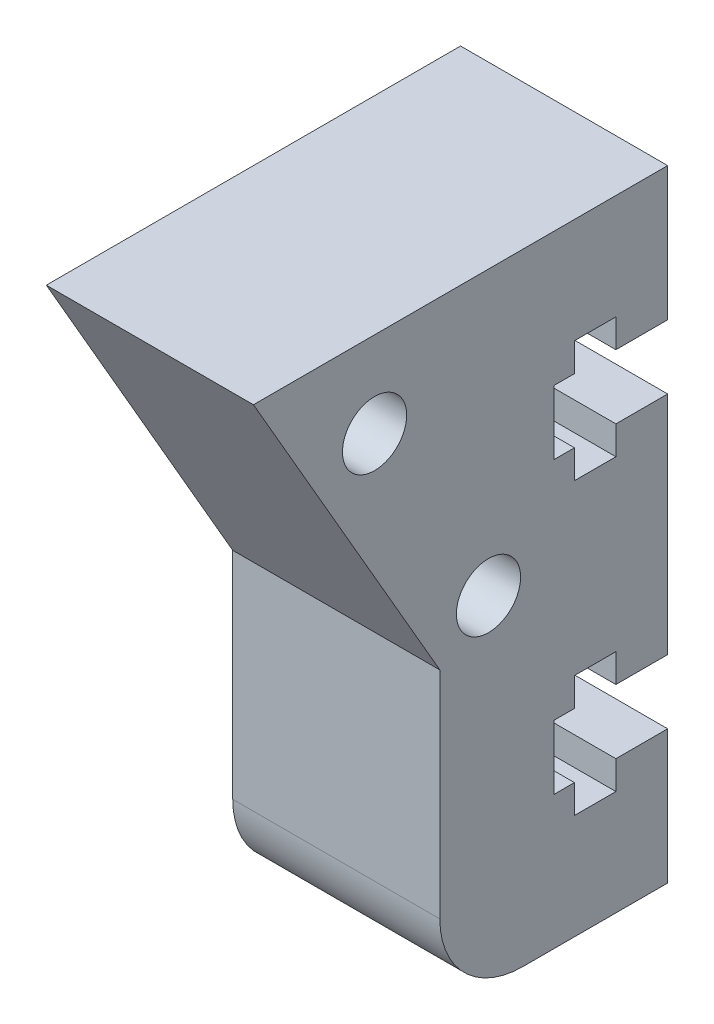
ISO-10303-21;
HEADER;
FILE_DESCRIPTION(('STEP AP214'),'2;1');
FILE_NAME('part.step','',(''),(''),'','','');
FILE_SCHEMA(('AUTOMOTIVE_DESIGN { 1 0 10303 214 1 1 1 1 }'));
ENDSEC;
DATA;
#1=APPLICATION_CONTEXT('core data for automotive mechanical design processes');
#2=APPLICATION_PROTOCOL_DEFINITION('international standard','automotive_design',2000,#1);
#3=PRODUCT_CONTEXT('',#1,'mechanical');
#4=PRODUCT('Part','Part','',(#3));
#5=PRODUCT_RELATED_PRODUCT_CATEGORY('part','',(#4));
#6=PRODUCT_DEFINITION_FORMATION('','',#4);
#7=PRODUCT_DEFINITION_CONTEXT('part definition',#1,'design');
#8=PRODUCT_DEFINITION('design','',#6,#7);
#9=PRODUCT_DEFINITION_SHAPE('','',#8);
#10=(LENGTH_UNIT() NAMED_UNIT(*) SI_UNIT(.MILLI.,.METRE.));
#11=(NAMED_UNIT(*) PLANE_ANGLE_UNIT() SI_UNIT($,.RADIAN.));
#12=(NAMED_UNIT(*) SI_UNIT($,.STERADIAN.) SOLID_ANGLE_UNIT());
#13=UNCERTAINTY_MEASURE_WITH_UNIT(LENGTH_MEASURE(1.E-05),#10,'distance_accuracy_value','');
#14=(GEOMETRIC_REPRESENTATION_CONTEXT(3) GLOBAL_UNCERTAINTY_ASSIGNED_CONTEXT((#13)) GLOBAL_UNIT_ASSIGNED_CONTEXT((#10,
#11,#12)) REPRESENTATION_CONTEXT('',''));
#15=CARTESIAN_POINT('',(0.,0.,0.));
#16=DIRECTION('',(0.,0.,1.));
#17=DIRECTION('',(1.,0.,0.));
#18=AXIS2_PLACEMENT_3D('',#15,#16,#17);
#19=CARTESIAN_POINT('',(170.434880274018,63.9423133029425,11.));
#20=DIRECTION('',(0.,0.,-1.));
#21=DIRECTION('',(0.,1.,0.));
#22=AXIS2_PLACEMENT_3D('',#19,#20,#21);
#23=PLANE('',#22);
#24=DIRECTION('',(1.,0.,0.));
#25=VECTOR('',#24,1.);
#26=CARTESIAN_POINT('',(170.434880274018,53.5307705710611,11.));
#27=LINE('',#26,#25);
#28=CARTESIAN_POINT('',(170.434880274018,53.5307705710611,11.));
#29=VERTEX_POINT('',#28);
#30=CARTESIAN_POINT('',(180.434880274018,53.5307705710611,11.));
#31=VERTEX_POINT('',#30);
#32=EDGE_CURVE('E229',#29,#31,#27,.T.);
#33=ORIENTED_EDGE('',*,*,#32,.T.);
#34=DIRECTION('',(0.,1.,0.));
#35=VECTOR('',#34,1.);
#36=CARTESIAN_POINT('',(180.434880274018,63.9423133029425,11.));
#37=LINE('',#36,#35);
#38=CARTESIAN_POINT('',(180.434880274018,63.9423133029425,11.));
#39=VERTEX_POINT('',#38);
#40=EDGE_CURVE('E255',#31,#39,#37,.T.);
#41=ORIENTED_EDGE('',*,*,#40,.T.);
#42=DIRECTION('',(1.,0.,0.));
#43=VECTOR('',#42,1.);
#44=CARTESIAN_POINT('',(170.434880274018,63.9423133029425,11.));
#45=LINE('',#44,#43);
#46=CARTESIAN_POINT('',(170.434880274018,63.9423133029425,11.));
#47=VERTEX_POINT('',#46);
#48=EDGE_CURVE('E249',#47,#39,#45,.T.);
#49=ORIENTED_EDGE('',*,*,#48,.F.);
#50=DIRECTION('',(0.,1.,0.));
#51=VECTOR('',#50,1.);
#52=CARTESIAN_POINT('',(170.434880274018,63.9423133029425,11.));
#53=LINE('',#52,#51);
#54=EDGE_CURVE('E243',#29,#47,#53,.T.);
#55=ORIENTED_EDGE('',*,*,#54,.F.);
#56=EDGE_LOOP('',(#33,#41,#49,#55));
#57=FACE_BOUND('',#56,.T.);
#58=ADVANCED_FACE('F34',(#57),#23,.F.);
#59=CARTESIAN_POINT('',(0.,0.,0.));
#60=DIRECTION('',(0.,0.,-1.));
#61=DIRECTION('',(-1.,0.,0.));
#62=AXIS2_PLACEMENT_3D('',#59,#60,#61);
#63=PLANE('',#62);
#64=DIRECTION('',(1.,0.,0.));
#65=VECTOR('',#64,1.);
#66=CARTESIAN_POINT('',(170.434880274018,59.0807705710764,0.));
#67=LINE('',#66,#65);
#68=CARTESIAN_POINT('',(170.434880274018,59.0807705710764,0.));
#69=VERTEX_POINT('',#68);
#70=CARTESIAN_POINT('',(180.434880274018,59.0807705710764,0.));
#71=VERTEX_POINT('',#70);
#72=EDGE_CURVE('E332',#69,#71,#67,.T.);
#73=ORIENTED_EDGE('',*,*,#72,.F.);
#74=DIRECTION('',(0.,-1.,0.));
#75=VECTOR('',#74,1.);
#76=CARTESIAN_POINT('',(170.434880274018,79.5307705710627,0.));
#77=LINE('',#76,#75);
#78=CARTESIAN_POINT('',(170.434880274018,69.9807705710764,0.));
#79=VERTEX_POINT('',#78);
#80=EDGE_CURVE('E459',#79,#69,#77,.T.);
#81=ORIENTED_EDGE('',*,*,#80,.F.);
#82=DIRECTION('',(1.,0.,0.));
#83=VECTOR('',#82,1.);
#84=CARTESIAN_POINT('',(170.434880274018,69.9807705710764,0.));
#85=LINE('',#84,#83);
#86=CARTESIAN_POINT('',(180.434880274018,69.9807705710764,0.));
#87=VERTEX_POINT('',#86);
#88=EDGE_CURVE('E425',#79,#87,#85,.T.);
#89=ORIENTED_EDGE('',*,*,#88,.T.);
#90=DIRECTION('',(0.,1.,0.));
#91=VECTOR('',#90,1.);
#92=CARTESIAN_POINT('',(180.434880274018,79.5307705710627,0.));
#93=LINE('',#92,#91);
#94=EDGE_CURVE('E451',#71,#87,#93,.T.);
#95=ORIENTED_EDGE('',*,*,#94,.F.);
#96=EDGE_LOOP('',(#73,#81,#89,#95));
#97=FACE_BOUND('',#96,.T.);
#98=ADVANCED_FACE('F533',(#97),#63,.T.);
#99=DIRECTION('',(1.,0.,0.));
#100=VECTOR('',#99,1.);
#101=CARTESIAN_POINT('',(170.434880274018,73.0807705710764,0.));
#102=LINE('',#101,#100);
#103=CARTESIAN_POINT('',(170.434880274018,73.0807705710764,0.));
#104=VERTEX_POINT('',#103);
#105=CARTESIAN_POINT('',(180.434880274018,73.0807705710764,0.));
#106=VERTEX_POINT('',#105);
#107=EDGE_CURVE('E422',#104,#106,#102,.T.);
#108=ORIENTED_EDGE('',*,*,#107,.F.);
#109=CARTESIAN_POINT('',(170.434880274018,79.5307705710627,0.));
#110=VERTEX_POINT('',#109);
#111=EDGE_CURVE('E455',#110,#104,#77,.T.);
#112=ORIENTED_EDGE('',*,*,#111,.F.);
#113=DIRECTION('',(-1.,0.,0.));
#114=VECTOR('',#113,1.);
#115=CARTESIAN_POINT('',(180.434880274018,79.5307705710627,0.));
#116=LINE('',#115,#114);
#117=CARTESIAN_POINT('',(180.434880274018,79.5307705710627,0.));
#118=VERTEX_POINT('',#117);
#119=EDGE_CURVE('E450',#118,#110,#116,.T.);
#120=ORIENTED_EDGE('',*,*,#119,.F.);
#121=EDGE_CURVE('E424',#106,#118,#93,.T.);
#122=ORIENTED_EDGE('',*,*,#121,.F.);
#123=EDGE_LOOP('',(#108,#112,#120,#122));
#124=FACE_BOUND('',#123,.T.);
#125=ADVANCED_FACE('F545',(#124),#63,.T.);
#126=CARTESIAN_POINT('',(180.434880274018,79.5307705710627,30.));
#127=DIRECTION('',(-1.,0.,0.));
#128=DIRECTION('',(0.,0.,1.));
#129=AXIS2_PLACEMENT_3D('',#126,#127,#128);
#130=PLANE('',#129);
#131=CARTESIAN_POINT('',(180.434880274018,75.401605446463,14.1519237886476));
#132=DIRECTION('',(1.,0.,0.));
#133=DIRECTION('',(0.,0.,-1.));
#134=AXIS2_PLACEMENT_3D('',#131,#132,#133);
#135=CIRCLE('',#134,1.54999999999999);
#136=CARTESIAN_POINT('',(180.434880274018,75.401605446463,12.6019237886476));
#137=VERTEX_POINT('',#136);
#138=EDGE_CURVE('E472',#137,#137,#135,.T.);
#139=ORIENTED_EDGE('',*,*,#138,.F.);
#140=EDGE_LOOP('',(#139));
#141=FACE_BOUND('',#140,.T.);
#142=CARTESIAN_POINT('',(180.434880274018,65.8753260048354,8.65192378864772));
#143=DIRECTION('',(1.,0.,0.));
#144=DIRECTION('',(0.,0.,-1.));
#145=AXIS2_PLACEMENT_3D('',#142,#143,#144);
#146=CIRCLE('',#145,1.55000000000021);
#147=CARTESIAN_POINT('',(180.434880274018,65.8753260048354,7.1019237886475));
#148=VERTEX_POINT('',#147);
#149=EDGE_CURVE('E258',#148,#148,#146,.T.);
#150=ORIENTED_EDGE('',*,*,#149,.F.);
#151=EDGE_LOOP('',(#150));
#152=FACE_BOUND('',#151,.T.);
#153=ORIENTED_EDGE('',*,*,#40,.F.);
#154=CARTESIAN_POINT('',(180.434880274018,53.530770571061,7.));
#155=DIRECTION('',(-1.,0.,0.));
#156=DIRECTION('',(0.,0.,-1.));
#157=AXIS2_PLACEMENT_3D('',#154,#155,#156);
#158=CIRCLE('',#157,4.);
#159=CARTESIAN_POINT('',(180.434880274018,49.530770571061,6.99999999999997));
#160=VERTEX_POINT('',#159);
#161=EDGE_CURVE('E51',#160,#31,#158,.T.);
#162=ORIENTED_EDGE('',*,*,#161,.F.);
#163=DIRECTION('',(0.,0.,-1.));
#164=VECTOR('',#163,1.);
#165=CARTESIAN_POINT('',(180.434880274018,49.530770571061,30.));
#166=LINE('',#165,#164);
#167=CARTESIAN_POINT('',(180.434880274018,49.530770571061,0.));
#168=VERTEX_POINT('',#167);
#169=EDGE_CURVE('E462',#160,#168,#166,.T.);
#170=ORIENTED_EDGE('',*,*,#169,.T.);
#171=CARTESIAN_POINT('',(180.434880274018,55.9807705710764,0.));
#172=VERTEX_POINT('',#171);
#173=EDGE_CURVE('E447',#168,#172,#93,.T.);
#174=ORIENTED_EDGE('',*,*,#173,.T.);
#175=DIRECTION('',(0.,0.,-1.));
#176=VECTOR('',#175,1.);
#177=CARTESIAN_POINT('',(180.434880274018,55.9807705710764,0.));
#178=LINE('',#177,#176);
#179=CARTESIAN_POINT('',(180.434880274018,55.9807705710764,2.5));
#180=VERTEX_POINT('',#179);
#181=EDGE_CURVE('E59',#180,#172,#178,.T.);
#182=ORIENTED_EDGE('',*,*,#181,.F.);
#183=DIRECTION('',(0.,1.,0.));
#184=VECTOR('',#183,1.);
#185=CARTESIAN_POINT('',(180.434880274018,55.9807705710764,2.5));
#186=LINE('',#185,#184);
#187=CARTESIAN_POINT('',(180.434880274018,54.6057705710764,2.5));
#188=VERTEX_POINT('',#187);
#189=EDGE_CURVE('E328',#188,#180,#186,.T.);
#190=ORIENTED_EDGE('',*,*,#189,.F.);
#191=DIRECTION('',(0.,0.,-1.));
#192=VECTOR('',#191,1.);
#193=CARTESIAN_POINT('',(180.434880274018,54.6057705710764,4.5));
#194=LINE('',#193,#192);
#195=CARTESIAN_POINT('',(180.434880274018,54.6057705710764,4.5));
#196=VERTEX_POINT('',#195);
#197=EDGE_CURVE('E325',#196,#188,#194,.T.);
#198=ORIENTED_EDGE('',*,*,#197,.F.);
#199=DIRECTION('',(0.,-1.,0.));
#200=VECTOR('',#199,1.);
#201=CARTESIAN_POINT('',(180.434880274018,55.9807705710764,4.5));
#202=LINE('',#201,#200);
#203=CARTESIAN_POINT('',(180.434880274018,55.9807705710764,4.5));
#204=VERTEX_POINT('',#203);
#205=EDGE_CURVE('E322',#204,#196,#202,.T.);
#206=ORIENTED_EDGE('',*,*,#205,.F.);
#207=DIRECTION('',(0.,0.,-1.));
#208=VECTOR('',#207,1.);
#209=CARTESIAN_POINT('',(180.434880274018,55.9807705710764,4.5));
#210=LINE('',#209,#208);
#211=CARTESIAN_POINT('',(180.434880274018,55.9807705710764,5.5));
#212=VERTEX_POINT('',#211);
#213=EDGE_CURVE('E319',#212,#204,#210,.T.);
#214=ORIENTED_EDGE('',*,*,#213,.F.);
#215=DIRECTION('',(0.,-1.,0.));
#216=VECTOR('',#215,1.);
#217=CARTESIAN_POINT('',(180.434880274018,59.0807705710764,5.5));
#218=LINE('',#217,#216);
#219=CARTESIAN_POINT('',(180.434880274018,59.0807705710764,5.5));
#220=VERTEX_POINT('',#219);
#221=EDGE_CURVE('E316',#220,#212,#218,.T.);
#222=ORIENTED_EDGE('',*,*,#221,.F.);
#223=DIRECTION('',(0.,0.,1.));
#224=VECTOR('',#223,1.);
#225=CARTESIAN_POINT('',(180.434880274018,59.0807705710764,4.5));
#226=LINE('',#225,#224);
#227=CARTESIAN_POINT('',(180.434880274018,59.0807705710764,4.5));
#228=VERTEX_POINT('',#227);
#229=EDGE_CURVE('E313',#228,#220,#226,.T.);
#230=ORIENTED_EDGE('',*,*,#229,.F.);
#231=DIRECTION('',(0.,-1.,0.));
#232=VECTOR('',#231,1.);
#233=CARTESIAN_POINT('',(180.434880274018,60.4557705710764,4.5));
#234=LINE('',#233,#232);
#235=CARTESIAN_POINT('',(180.434880274018,60.4557705710764,4.5));
#236=VERTEX_POINT('',#235);
#237=EDGE_CURVE('E310',#236,#228,#234,.T.);
#238=ORIENTED_EDGE('',*,*,#237,.F.);
#239=DIRECTION('',(0.,0.,1.));
#240=VECTOR('',#239,1.);
#241=CARTESIAN_POINT('',(180.434880274018,60.4557705710764,4.5));
#242=LINE('',#241,#240);
#243=CARTESIAN_POINT('',(180.434880274018,60.4557705710764,2.5));
#244=VERTEX_POINT('',#243);
#245=EDGE_CURVE('E307',#244,#236,#242,.T.);
#246=ORIENTED_EDGE('',*,*,#245,.F.);
#247=DIRECTION('',(0.,1.,0.));
#248=VECTOR('',#247,1.);
#249=CARTESIAN_POINT('',(180.434880274018,60.4557705710764,2.5));
#250=LINE('',#249,#248);
#251=CARTESIAN_POINT('',(180.434880274018,59.0807705710764,2.5));
#252=VERTEX_POINT('',#251);
#253=EDGE_CURVE('E304',#252,#244,#250,.T.);
#254=ORIENTED_EDGE('',*,*,#253,.F.);
#255=DIRECTION('',(0.,0.,1.));
#256=VECTOR('',#255,1.);
#257=CARTESIAN_POINT('',(180.434880274018,59.0807705710764,0.));
#258=LINE('',#257,#256);
#259=EDGE_CURVE('E266',#71,#252,#258,.T.);
#260=ORIENTED_EDGE('',*,*,#259,.F.);
#261=ORIENTED_EDGE('',*,*,#94,.T.);
#262=DIRECTION('',(0.,0.,-1.));
#263=VECTOR('',#262,1.);
#264=CARTESIAN_POINT('',(180.434880274018,69.9807705710764,0.));
#265=LINE('',#264,#263);
#266=CARTESIAN_POINT('',(180.434880274018,69.9807705710764,2.5));
#267=VERTEX_POINT('',#266);
#268=EDGE_CURVE('E360',#267,#87,#265,.T.);
#269=ORIENTED_EDGE('',*,*,#268,.F.);
#270=DIRECTION('',(0.,1.,0.));
#271=VECTOR('',#270,1.);
#272=CARTESIAN_POINT('',(180.434880274018,69.9807705710764,2.5));
#273=LINE('',#272,#271);
#274=CARTESIAN_POINT('',(180.434880274018,68.6057705710764,2.5));
#275=VERTEX_POINT('',#274);
#276=EDGE_CURVE('E417',#275,#267,#273,.T.);
#277=ORIENTED_EDGE('',*,*,#276,.F.);
#278=DIRECTION('',(0.,0.,-1.));
#279=VECTOR('',#278,1.);
#280=CARTESIAN_POINT('',(180.434880274018,68.6057705710764,4.5));
#281=LINE('',#280,#279);
#282=CARTESIAN_POINT('',(180.434880274018,68.6057705710764,4.5));
#283=VERTEX_POINT('',#282);
#284=EDGE_CURVE('E414',#283,#275,#281,.T.);
#285=ORIENTED_EDGE('',*,*,#284,.F.);
#286=DIRECTION('',(0.,-1.,0.));
#287=VECTOR('',#286,1.);
#288=CARTESIAN_POINT('',(180.434880274018,69.9807705710764,4.5));
#289=LINE('',#288,#287);
#290=CARTESIAN_POINT('',(180.434880274018,69.9807705710764,4.5));
#291=VERTEX_POINT('',#290);
#292=EDGE_CURVE('E411',#291,#283,#289,.T.);
#293=ORIENTED_EDGE('',*,*,#292,.F.);
#294=DIRECTION('',(0.,0.,-1.));
#295=VECTOR('',#294,1.);
#296=CARTESIAN_POINT('',(180.434880274018,69.9807705710764,4.5));
#297=LINE('',#296,#295);
#298=CARTESIAN_POINT('',(180.434880274018,69.9807705710764,5.5));
#299=VERTEX_POINT('',#298);
#300=EDGE_CURVE('E408',#299,#291,#297,.T.);
#301=ORIENTED_EDGE('',*,*,#300,.F.);
#302=DIRECTION('',(0.,-1.,0.));
#303=VECTOR('',#302,1.);
#304=CARTESIAN_POINT('',(180.434880274018,73.0807705710764,5.5));
#305=LINE('',#304,#303);
#306=CARTESIAN_POINT('',(180.434880274018,73.0807705710764,5.5));
#307=VERTEX_POINT('',#306);
#308=EDGE_CURVE('E405',#307,#299,#305,.T.);
#309=ORIENTED_EDGE('',*,*,#308,.F.);
#310=DIRECTION('',(0.,0.,1.));
#311=VECTOR('',#310,1.);
#312=CARTESIAN_POINT('',(180.434880274018,73.0807705710764,4.5));
#313=LINE('',#312,#311);
#314=CARTESIAN_POINT('',(180.434880274018,73.0807705710764,4.5));
#315=VERTEX_POINT('',#314);
#316=EDGE_CURVE('E402',#315,#307,#313,.T.);
#317=ORIENTED_EDGE('',*,*,#316,.F.);
#318=DIRECTION('',(0.,-1.,0.));
#319=VECTOR('',#318,1.);
#320=CARTESIAN_POINT('',(180.434880274018,74.4557705710764,4.5));
#321=LINE('',#320,#319);
#322=CARTESIAN_POINT('',(180.434880274018,74.4557705710764,4.5));
#323=VERTEX_POINT('',#322);
#324=EDGE_CURVE('E399',#323,#315,#321,.T.);
#325=ORIENTED_EDGE('',*,*,#324,.F.);
#326=DIRECTION('',(0.,0.,1.));
#327=VECTOR('',#326,1.);
#328=CARTESIAN_POINT('',(180.434880274018,74.4557705710764,4.5));
#329=LINE('',#328,#327);
#330=CARTESIAN_POINT('',(180.434880274018,74.4557705710764,2.5));
#331=VERTEX_POINT('',#330);
#332=EDGE_CURVE('E396',#331,#323,#329,.T.);
#333=ORIENTED_EDGE('',*,*,#332,.F.);
#334=DIRECTION('',(0.,1.,0.));
#335=VECTOR('',#334,1.);
#336=CARTESIAN_POINT('',(180.434880274018,74.4557705710764,2.5));
#337=LINE('',#336,#335);
#338=CARTESIAN_POINT('',(180.434880274018,73.0807705710764,2.5));
#339=VERTEX_POINT('',#338);
#340=EDGE_CURVE('E393',#339,#331,#337,.T.);
#341=ORIENTED_EDGE('',*,*,#340,.F.);
#342=DIRECTION('',(0.,0.,1.));
#343=VECTOR('',#342,1.);
#344=CARTESIAN_POINT('',(180.434880274018,73.0807705710764,0.));
#345=LINE('',#344,#343);
#346=EDGE_CURVE('E334',#106,#339,#345,.T.);
#347=ORIENTED_EDGE('',*,*,#346,.F.);
#348=ORIENTED_EDGE('',*,*,#121,.T.);
#349=DIRECTION('',(0.,0.,-1.));
#350=VECTOR('',#349,1.);
#351=CARTESIAN_POINT('',(180.434880274018,79.5307705710627,30.));
#352=LINE('',#351,#350);
#353=CARTESIAN_POINT('',(180.434880274018,79.5307705710627,20.0000000000016));
#354=VERTEX_POINT('',#353);
#355=EDGE_CURVE('E11',#354,#118,#352,.T.);
#356=ORIENTED_EDGE('',*,*,#355,.F.);
#357=DIRECTION('',(0.,0.866025403784406,0.500000000000057));
#358=VECTOR('',#357,1.);
#359=CARTESIAN_POINT('',(180.434880274018,79.5307705710627,20.0000000000016));
#360=LINE('',#359,#358);
#361=EDGE_CURVE('E252',#39,#354,#360,.T.);
#362=ORIENTED_EDGE('',*,*,#361,.F.);
#363=EDGE_LOOP('',(#153,#162,#170,#174,#182,#190,#198,#206,#214,#222,#230,#238,#246,#254,#260,
#261,#269,#277,#285,#293,#301,#309,#317,#325,#333,#341,#347,#348,#356,#362));
#364=FACE_BOUND('',#363,.T.);
#365=ADVANCED_FACE('F36',(#141,#152,#364),#130,.F.);
#366=CARTESIAN_POINT('',(180.434880274018,79.5307705710627,30.));
#367=DIRECTION('',(0.,-1.,0.));
#368=DIRECTION('',(0.,0.,-1.));
#369=AXIS2_PLACEMENT_3D('',#366,#367,#368);
#370=PLANE('',#369);
#371=DIRECTION('',(0.,0.,-1.));
#372=VECTOR('',#371,1.);
#373=CARTESIAN_POINT('',(170.434880274018,79.5307705710627,30.));
#374=LINE('',#373,#372);
#375=CARTESIAN_POINT('',(170.434880274018,79.5307705710627,20.0000000000016));
#376=VERTEX_POINT('',#375);
#377=EDGE_CURVE('E43',#376,#110,#374,.T.);
#378=ORIENTED_EDGE('',*,*,#377,.F.);
#379=DIRECTION('',(1.,0.,0.));
#380=VECTOR('',#379,1.);
#381=CARTESIAN_POINT('',(170.434880274018,79.5307705710627,20.0000000000016));
#382=LINE('',#381,#380);
#383=EDGE_CURVE('E263',#376,#354,#382,.T.);
#384=ORIENTED_EDGE('',*,*,#383,.T.);
#385=ORIENTED_EDGE('',*,*,#355,.T.);
#386=ORIENTED_EDGE('',*,*,#119,.T.);
#387=EDGE_LOOP('',(#378,#384,#385,#386));
#388=FACE_BOUND('',#387,.T.);
#389=ADVANCED_FACE('F548',(#388),#370,.F.);
#390=CARTESIAN_POINT('',(170.434880274018,79.5307705710627,30.));
#391=DIRECTION('',(1.,0.,0.));
#392=DIRECTION('',(0.,0.,-1.));
#393=AXIS2_PLACEMENT_3D('',#390,#391,#392);
#394=PLANE('',#393);
#395=CARTESIAN_POINT('',(170.434880274018,75.401605446463,14.1519237886476));
#396=DIRECTION('',(1.,0.,0.));
#397=DIRECTION('',(0.,0.,-1.));
#398=AXIS2_PLACEMENT_3D('',#395,#396,#397);
#399=CIRCLE('',#398,1.54999999999999);
#400=CARTESIAN_POINT('',(170.434880274018,75.401605446463,12.6019237886476));
#401=VERTEX_POINT('',#400);
#402=EDGE_CURVE('E38',#401,#401,#399,.T.);
#403=ORIENTED_EDGE('',*,*,#402,.T.);
#404=EDGE_LOOP('',(#403));
#405=FACE_BOUND('',#404,.T.);
#406=CARTESIAN_POINT('',(170.434880274018,65.8753260048354,8.65192378864772));
#407=DIRECTION('',(1.,0.,0.));
#408=DIRECTION('',(0.,0.,-1.));
#409=AXIS2_PLACEMENT_3D('',#406,#407,#408);
#410=CIRCLE('',#409,1.55000000000021);
#411=CARTESIAN_POINT('',(170.434880274018,65.8753260048354,7.1019237886475));
#412=VERTEX_POINT('',#411);
#413=EDGE_CURVE('E261',#412,#412,#410,.T.);
#414=ORIENTED_EDGE('',*,*,#413,.T.);
#415=EDGE_LOOP('',(#414));
#416=FACE_BOUND('',#415,.T.);
#417=DIRECTION('',(0.,0.,-1.));
#418=VECTOR('',#417,1.);
#419=CARTESIAN_POINT('',(170.434880274018,49.530770571061,30.));
#420=LINE('',#419,#418);
#421=CARTESIAN_POINT('',(170.434880274018,49.530770571061,6.99999999999997));
#422=VERTEX_POINT('',#421);
#423=CARTESIAN_POINT('',(170.434880274018,49.530770571061,0.));
#424=VERTEX_POINT('',#423);
#425=EDGE_CURVE('E246',#422,#424,#420,.T.);
#426=ORIENTED_EDGE('',*,*,#425,.F.);
#427=CARTESIAN_POINT('',(170.434880274018,53.530770571061,7.));
#428=DIRECTION('',(-1.,0.,0.));
#429=DIRECTION('',(0.,0.,-1.));
#430=AXIS2_PLACEMENT_3D('',#427,#428,#429);
#431=CIRCLE('',#430,4.);
#432=EDGE_CURVE('E232',#422,#29,#431,.T.);
#433=ORIENTED_EDGE('',*,*,#432,.T.);
#434=ORIENTED_EDGE('',*,*,#54,.T.);
#435=DIRECTION('',(0.,0.866025403784406,0.500000000000057));
#436=VECTOR('',#435,1.);
#437=CARTESIAN_POINT('',(170.434880274018,79.5307705710627,20.0000000000016));
#438=LINE('',#437,#436);
#439=EDGE_CURVE('E251',#47,#376,#438,.T.);
#440=ORIENTED_EDGE('',*,*,#439,.T.);
#441=ORIENTED_EDGE('',*,*,#377,.T.);
#442=ORIENTED_EDGE('',*,*,#111,.T.);
#443=DIRECTION('',(0.,0.,1.));
#444=VECTOR('',#443,1.);
#445=CARTESIAN_POINT('',(170.434880274018,73.0807705710764,0.));
#446=LINE('',#445,#444);
#447=CARTESIAN_POINT('',(170.434880274018,73.0807705710764,2.5));
#448=VERTEX_POINT('',#447);
#449=EDGE_CURVE('E356',#104,#448,#446,.T.);
#450=ORIENTED_EDGE('',*,*,#449,.T.);
#451=DIRECTION('',(0.,1.,0.));
#452=VECTOR('',#451,1.);
#453=CARTESIAN_POINT('',(170.434880274018,74.4557705710764,2.5));
#454=LINE('',#453,#452);
#455=CARTESIAN_POINT('',(170.434880274018,74.4557705710764,2.5));
#456=VERTEX_POINT('',#455);
#457=EDGE_CURVE('E359',#448,#456,#454,.T.);
#458=ORIENTED_EDGE('',*,*,#457,.T.);
#459=DIRECTION('',(0.,0.,1.));
#460=VECTOR('',#459,1.);
#461=CARTESIAN_POINT('',(170.434880274018,74.4557705710764,4.5));
#462=LINE('',#461,#460);
#463=CARTESIAN_POINT('',(170.434880274018,74.4557705710764,4.5));
#464=VERTEX_POINT('',#463);
#465=EDGE_CURVE('E363',#456,#464,#462,.T.);
#466=ORIENTED_EDGE('',*,*,#465,.T.);
#467=DIRECTION('',(0.,-1.,0.));
#468=VECTOR('',#467,1.);
#469=CARTESIAN_POINT('',(170.434880274018,74.4557705710764,4.5));
#470=LINE('',#469,#468);
#471=CARTESIAN_POINT('',(170.434880274018,73.0807705710764,4.5));
#472=VERTEX_POINT('',#471);
#473=EDGE_CURVE('E366',#464,#472,#470,.T.);
#474=ORIENTED_EDGE('',*,*,#473,.T.);
#475=DIRECTION('',(0.,0.,1.));
#476=VECTOR('',#475,1.);
#477=CARTESIAN_POINT('',(170.434880274018,73.0807705710764,4.5));
#478=LINE('',#477,#476);
#479=CARTESIAN_POINT('',(170.434880274018,73.0807705710764,5.5));
#480=VERTEX_POINT('',#479);
#481=EDGE_CURVE('E369',#472,#480,#478,.T.);
#482=ORIENTED_EDGE('',*,*,#481,.T.);
#483=DIRECTION('',(0.,-1.,0.));
#484=VECTOR('',#483,1.);
#485=CARTESIAN_POINT('',(170.434880274018,73.0807705710764,5.5));
#486=LINE('',#485,#484);
#487=CARTESIAN_POINT('',(170.434880274018,69.9807705710764,5.5));
#488=VERTEX_POINT('',#487);
#489=EDGE_CURVE('E372',#480,#488,#486,.T.);
#490=ORIENTED_EDGE('',*,*,#489,.T.);
#491=DIRECTION('',(0.,0.,-1.));
#492=VECTOR('',#491,1.);
#493=CARTESIAN_POINT('',(170.434880274018,69.9807705710764,4.5));
#494=LINE('',#493,#492);
#495=CARTESIAN_POINT('',(170.434880274018,69.9807705710764,4.5));
#496=VERTEX_POINT('',#495);
#497=EDGE_CURVE('E375',#488,#496,#494,.T.);
#498=ORIENTED_EDGE('',*,*,#497,.T.);
#499=DIRECTION('',(0.,-1.,0.));
#500=VECTOR('',#499,1.);
#501=CARTESIAN_POINT('',(170.434880274018,69.9807705710764,4.5));
#502=LINE('',#501,#500);
#503=CARTESIAN_POINT('',(170.434880274018,68.6057705710764,4.5));
#504=VERTEX_POINT('',#503);
#505=EDGE_CURVE('E378',#496,#504,#502,.T.);
#506=ORIENTED_EDGE('',*,*,#505,.T.);
#507=DIRECTION('',(0.,0.,-1.));
#508=VECTOR('',#507,1.);
#509=CARTESIAN_POINT('',(170.434880274018,68.6057705710764,4.5));
#510=LINE('',#509,#508);
#511=CARTESIAN_POINT('',(170.434880274018,68.6057705710764,2.5));
#512=VERTEX_POINT('',#511);
#513=EDGE_CURVE('E381',#504,#512,#510,.T.);
#514=ORIENTED_EDGE('',*,*,#513,.T.);
#515=DIRECTION('',(0.,1.,0.));
#516=VECTOR('',#515,1.);
#517=CARTESIAN_POINT('',(170.434880274018,69.9807705710764,2.5));
#518=LINE('',#517,#516);
#519=CARTESIAN_POINT('',(170.434880274018,69.9807705710764,2.5));
#520=VERTEX_POINT('',#519);
#521=EDGE_CURVE('E384',#512,#520,#518,.T.);
#522=ORIENTED_EDGE('',*,*,#521,.T.);
#523=DIRECTION('',(0.,0.,-1.));
#524=VECTOR('',#523,1.);
#525=CARTESIAN_POINT('',(170.434880274018,69.9807705710764,0.));
#526=LINE('',#525,#524);
#527=EDGE_CURVE('E387',#520,#79,#526,.T.);
#528=ORIENTED_EDGE('',*,*,#527,.T.);
#529=ORIENTED_EDGE('',*,*,#80,.T.);
#530=DIRECTION('',(0.,0.,1.));
#531=VECTOR('',#530,1.);
#532=CARTESIAN_POINT('',(170.434880274018,59.0807705710764,0.));
#533=LINE('',#532,#531);
#534=CARTESIAN_POINT('',(170.434880274018,59.0807705710764,2.5));
#535=VERTEX_POINT('',#534);
#536=EDGE_CURVE('E268',#69,#535,#533,.T.);
#537=ORIENTED_EDGE('',*,*,#536,.T.);
#538=DIRECTION('',(0.,1.,0.));
#539=VECTOR('',#538,1.);
#540=CARTESIAN_POINT('',(170.434880274018,60.4557705710764,2.5));
#541=LINE('',#540,#539);
#542=CARTESIAN_POINT('',(170.434880274018,60.4557705710764,2.5));
#543=VERTEX_POINT('',#542);
#544=EDGE_CURVE('E271',#535,#543,#541,.T.);
#545=ORIENTED_EDGE('',*,*,#544,.T.);
#546=DIRECTION('',(0.,0.,1.));
#547=VECTOR('',#546,1.);
#548=CARTESIAN_POINT('',(170.434880274018,60.4557705710764,4.5));
#549=LINE('',#548,#547);
#550=CARTESIAN_POINT('',(170.434880274018,60.4557705710764,4.5));
#551=VERTEX_POINT('',#550);
#552=EDGE_CURVE('E274',#543,#551,#549,.T.);
#553=ORIENTED_EDGE('',*,*,#552,.T.);
#554=DIRECTION('',(0.,-1.,0.));
#555=VECTOR('',#554,1.);
#556=CARTESIAN_POINT('',(170.434880274018,60.4557705710764,4.5));
#557=LINE('',#556,#555);
#558=CARTESIAN_POINT('',(170.434880274018,59.0807705710764,4.5));
#559=VERTEX_POINT('',#558);
#560=EDGE_CURVE('E277',#551,#559,#557,.T.);
#561=ORIENTED_EDGE('',*,*,#560,.T.);
#562=DIRECTION('',(0.,0.,1.));
#563=VECTOR('',#562,1.);
#564=CARTESIAN_POINT('',(170.434880274018,59.0807705710764,4.5));
#565=LINE('',#564,#563);
#566=CARTESIAN_POINT('',(170.434880274018,59.0807705710764,5.5));
#567=VERTEX_POINT('',#566);
#568=EDGE_CURVE('E280',#559,#567,#565,.T.);
#569=ORIENTED_EDGE('',*,*,#568,.T.);
#570=DIRECTION('',(0.,-1.,0.));
#571=VECTOR('',#570,1.);
#572=CARTESIAN_POINT('',(170.434880274018,59.0807705710764,5.5));
#573=LINE('',#572,#571);
#574=CARTESIAN_POINT('',(170.434880274018,55.9807705710764,5.5));
#575=VERTEX_POINT('',#574);
#576=EDGE_CURVE('E283',#567,#575,#573,.T.);
#577=ORIENTED_EDGE('',*,*,#576,.T.);
#578=DIRECTION('',(0.,0.,-1.));
#579=VECTOR('',#578,1.);
#580=CARTESIAN_POINT('',(170.434880274018,55.9807705710764,4.5));
#581=LINE('',#580,#579);
#582=CARTESIAN_POINT('',(170.434880274018,55.9807705710764,4.5));
#583=VERTEX_POINT('',#582);
#584=EDGE_CURVE('E286',#575,#583,#581,.T.);
#585=ORIENTED_EDGE('',*,*,#584,.T.);
#586=DIRECTION('',(0.,-1.,0.));
#587=VECTOR('',#586,1.);
#588=CARTESIAN_POINT('',(170.434880274018,55.9807705710764,4.5));
#589=LINE('',#588,#587);
#590=CARTESIAN_POINT('',(170.434880274018,54.6057705710764,4.5));
#591=VERTEX_POINT('',#590);
#592=EDGE_CURVE('E289',#583,#591,#589,.T.);
#593=ORIENTED_EDGE('',*,*,#592,.T.);
#594=DIRECTION('',(0.,0.,-1.));
#595=VECTOR('',#594,1.);
#596=CARTESIAN_POINT('',(170.434880274018,54.6057705710764,4.5));
#597=LINE('',#596,#595);
#598=CARTESIAN_POINT('',(170.434880274018,54.6057705710764,2.5));
#599=VERTEX_POINT('',#598);
#600=EDGE_CURVE('E292',#591,#599,#597,.T.);
#601=ORIENTED_EDGE('',*,*,#600,.T.);
#602=DIRECTION('',(0.,1.,0.));
#603=VECTOR('',#602,1.);
#604=CARTESIAN_POINT('',(170.434880274018,55.9807705710764,2.5));
#605=LINE('',#604,#603);
#606=CARTESIAN_POINT('',(170.434880274018,55.9807705710764,2.5));
#607=VERTEX_POINT('',#606);
#608=EDGE_CURVE('E295',#599,#607,#605,.T.);
#609=ORIENTED_EDGE('',*,*,#608,.T.);
#610=DIRECTION('',(0.,0.,-1.));
#611=VECTOR('',#610,1.);
#612=CARTESIAN_POINT('',(170.434880274018,55.9807705710764,0.));
#613=LINE('',#612,#611);
#614=CARTESIAN_POINT('',(170.434880274018,55.9807705710764,0.));
#615=VERTEX_POINT('',#614);
#616=EDGE_CURVE('E298',#607,#615,#613,.T.);
#617=ORIENTED_EDGE('',*,*,#616,.T.);
#618=EDGE_CURVE('E454',#615,#424,#77,.T.);
#619=ORIENTED_EDGE('',*,*,#618,.T.);
#620=EDGE_LOOP('',(#426,#433,#434,#440,#441,#442,#450,#458,#466,#474,#482,#490,#498,#506,#514,
#522,#528,#529,#537,#545,#553,#561,#569,#577,#585,#593,#601,#609,#617,#619));
#621=FACE_BOUND('',#620,.T.);
#622=ADVANCED_FACE('F241',(#405,#416,#621),#394,.F.);
#623=CARTESIAN_POINT('',(180.434880274018,49.530770571061,30.));
#624=DIRECTION('',(0.,1.,0.));
#625=DIRECTION('',(0.,0.,1.));
#626=AXIS2_PLACEMENT_3D('',#623,#624,#625);
#627=PLANE('',#626);
#628=ORIENTED_EDGE('',*,*,#169,.F.);
#629=DIRECTION('',(1.,0.,0.));
#630=VECTOR('',#629,1.);
#631=CARTESIAN_POINT('',(170.434880274018,49.530770571061,6.99999999999997));
#632=LINE('',#631,#630);
#633=EDGE_CURVE('E237',#422,#160,#632,.T.);
#634=ORIENTED_EDGE('',*,*,#633,.F.);
#635=ORIENTED_EDGE('',*,*,#425,.T.);
#636=DIRECTION('',(1.,0.,0.));
#637=VECTOR('',#636,1.);
#638=CARTESIAN_POINT('',(180.434880274018,49.530770571061,0.));
#639=LINE('',#638,#637);
#640=EDGE_CURVE('E458',#424,#168,#639,.T.);
#641=ORIENTED_EDGE('',*,*,#640,.T.);
#642=EDGE_LOOP('',(#628,#634,#635,#641));
#643=FACE_BOUND('',#642,.T.);
#644=ADVANCED_FACE('F484',(#643),#627,.F.);
#645=DIRECTION('',(1.,0.,0.));
#646=VECTOR('',#645,1.);
#647=CARTESIAN_POINT('',(170.434880274018,55.9807705710764,0.));
#648=LINE('',#647,#646);
#649=EDGE_CURVE('E335',#615,#172,#648,.T.);
#650=ORIENTED_EDGE('',*,*,#649,.T.);
#651=ORIENTED_EDGE('',*,*,#173,.F.);
#652=ORIENTED_EDGE('',*,*,#640,.F.);
#653=ORIENTED_EDGE('',*,*,#618,.F.);
#654=EDGE_LOOP('',(#650,#651,#652,#653));
#655=FACE_BOUND('',#654,.T.);
#656=ADVANCED_FACE('F489',(#655),#63,.T.);
#657=CARTESIAN_POINT('',(170.434880274018,73.0807705710764,0.));
#658=DIRECTION('',(0.,1.,0.));
#659=DIRECTION('',(0.,0.,1.));
#660=AXIS2_PLACEMENT_3D('',#657,#658,#659);
#661=PLANE('',#660);
#662=ORIENTED_EDGE('',*,*,#346,.T.);
#663=DIRECTION('',(1.,0.,0.));
#664=VECTOR('',#663,1.);
#665=CARTESIAN_POINT('',(170.434880274018,73.0807705710764,2.5));
#666=LINE('',#665,#664);
#667=EDGE_CURVE('E390',#448,#339,#666,.T.);
#668=ORIENTED_EDGE('',*,*,#667,.F.);
#669=ORIENTED_EDGE('',*,*,#449,.F.);
#670=ORIENTED_EDGE('',*,*,#107,.T.);
#671=EDGE_LOOP('',(#662,#668,#669,#670));
#672=FACE_BOUND('',#671,.T.);
#673=ADVANCED_FACE('F553',(#672),#661,.F.);
#674=CARTESIAN_POINT('',(170.434880274018,69.9807705710764,0.));
#675=DIRECTION('',(0.,-1.,0.));
#676=DIRECTION('',(0.,0.,-1.));
#677=AXIS2_PLACEMENT_3D('',#674,#675,#676);
#678=PLANE('',#677);
#679=ORIENTED_EDGE('',*,*,#268,.T.);
#680=ORIENTED_EDGE('',*,*,#88,.F.);
#681=ORIENTED_EDGE('',*,*,#527,.F.);
#682=DIRECTION('',(1.,0.,0.));
#683=VECTOR('',#682,1.);
#684=CARTESIAN_POINT('',(170.434880274018,69.9807705710764,2.5));
#685=LINE('',#684,#683);
#686=EDGE_CURVE('E428',#520,#267,#685,.T.);
#687=ORIENTED_EDGE('',*,*,#686,.T.);
#688=EDGE_LOOP('',(#679,#680,#681,#687));
#689=FACE_BOUND('',#688,.T.);
#690=ADVANCED_FACE('F590',(#689),#678,.F.);
#691=CARTESIAN_POINT('',(170.434880274018,69.9807705710764,2.5));
#692=DIRECTION('',(0.,0.,-1.));
#693=DIRECTION('',(0.,1.,0.));
#694=AXIS2_PLACEMENT_3D('',#691,#692,#693);
#695=PLANE('',#694);
#696=ORIENTED_EDGE('',*,*,#276,.T.);
#697=ORIENTED_EDGE('',*,*,#686,.F.);
#698=ORIENTED_EDGE('',*,*,#521,.F.);
#699=DIRECTION('',(1.,0.,0.));
#700=VECTOR('',#699,1.);
#701=CARTESIAN_POINT('',(170.434880274018,68.6057705710764,2.5));
#702=LINE('',#701,#700);
#703=EDGE_CURVE('E430',#512,#275,#702,.T.);
#704=ORIENTED_EDGE('',*,*,#703,.T.);
#705=EDGE_LOOP('',(#696,#697,#698,#704));
#706=FACE_BOUND('',#705,.T.);
#707=ADVANCED_FACE('F587',(#706),#695,.F.);
#708=CARTESIAN_POINT('',(170.434880274018,68.6057705710764,4.5));
#709=DIRECTION('',(0.,-1.,0.));
#710=DIRECTION('',(0.,0.,-1.));
#711=AXIS2_PLACEMENT_3D('',#708,#709,#710);
#712=PLANE('',#711);
#713=ORIENTED_EDGE('',*,*,#284,.T.);
#714=ORIENTED_EDGE('',*,*,#703,.F.);
#715=ORIENTED_EDGE('',*,*,#513,.F.);
#716=DIRECTION('',(1.,0.,0.));
#717=VECTOR('',#716,1.);
#718=CARTESIAN_POINT('',(170.434880274018,68.6057705710764,4.5));
#719=LINE('',#718,#717);
#720=EDGE_CURVE('E432',#504,#283,#719,.T.);
#721=ORIENTED_EDGE('',*,*,#720,.T.);
#722=EDGE_LOOP('',(#713,#714,#715,#721));
#723=FACE_BOUND('',#722,.T.);
#724=ADVANCED_FACE('F583',(#723),#712,.F.);
#725=CARTESIAN_POINT('',(170.434880274018,69.9807705710764,4.5));
#726=DIRECTION('',(0.,0.,1.));
#727=DIRECTION('',(1.,0.,0.));
#728=AXIS2_PLACEMENT_3D('',#725,#726,#727);
#729=PLANE('',#728);
#730=ORIENTED_EDGE('',*,*,#292,.T.);
#731=ORIENTED_EDGE('',*,*,#720,.F.);
#732=ORIENTED_EDGE('',*,*,#505,.F.);
#733=DIRECTION('',(1.,0.,0.));
#734=VECTOR('',#733,1.);
#735=CARTESIAN_POINT('',(170.434880274018,69.9807705710764,4.5));
#736=LINE('',#735,#734);
#737=EDGE_CURVE('E434',#496,#291,#736,.T.);
#738=ORIENTED_EDGE('',*,*,#737,.T.);
#739=EDGE_LOOP('',(#730,#731,#732,#738));
#740=FACE_BOUND('',#739,.T.);
#741=ADVANCED_FACE('F579',(#740),#729,.F.);
#742=CARTESIAN_POINT('',(170.434880274018,69.9807705710764,4.5));
#743=DIRECTION('',(0.,-1.,0.));
#744=DIRECTION('',(0.,0.,-1.));
#745=AXIS2_PLACEMENT_3D('',#742,#743,#744);
#746=PLANE('',#745);
#747=ORIENTED_EDGE('',*,*,#300,.T.);
#748=ORIENTED_EDGE('',*,*,#737,.F.);
#749=ORIENTED_EDGE('',*,*,#497,.F.);
#750=DIRECTION('',(1.,0.,0.));
#751=VECTOR('',#750,1.);
#752=CARTESIAN_POINT('',(170.434880274018,69.9807705710764,5.5));
#753=LINE('',#752,#751);
#754=EDGE_CURVE('E436',#488,#299,#753,.T.);
#755=ORIENTED_EDGE('',*,*,#754,.T.);
#756=EDGE_LOOP('',(#747,#748,#749,#755));
#757=FACE_BOUND('',#756,.T.);
#758=ADVANCED_FACE('F575',(#757),#746,.F.);
#759=CARTESIAN_POINT('',(170.434880274018,73.0807705710764,5.5));
#760=DIRECTION('',(0.,0.,1.));
#761=DIRECTION('',(0.,-1.,0.));
#762=AXIS2_PLACEMENT_3D('',#759,#760,#761);
#763=PLANE('',#762);
#764=ORIENTED_EDGE('',*,*,#308,.T.);
#765=ORIENTED_EDGE('',*,*,#754,.F.);
#766=ORIENTED_EDGE('',*,*,#489,.F.);
#767=DIRECTION('',(1.,0.,0.));
#768=VECTOR('',#767,1.);
#769=CARTESIAN_POINT('',(170.434880274018,73.0807705710764,5.5));
#770=LINE('',#769,#768);
#771=EDGE_CURVE('E438',#480,#307,#770,.T.);
#772=ORIENTED_EDGE('',*,*,#771,.T.);
#773=EDGE_LOOP('',(#764,#765,#766,#772));
#774=FACE_BOUND('',#773,.T.);
#775=ADVANCED_FACE('F571',(#774),#763,.F.);
#776=CARTESIAN_POINT('',(170.434880274018,73.0807705710764,4.5));
#777=DIRECTION('',(0.,1.,0.));
#778=DIRECTION('',(0.,0.,1.));
#779=AXIS2_PLACEMENT_3D('',#776,#777,#778);
#780=PLANE('',#779);
#781=ORIENTED_EDGE('',*,*,#316,.T.);
#782=ORIENTED_EDGE('',*,*,#771,.F.);
#783=ORIENTED_EDGE('',*,*,#481,.F.);
#784=DIRECTION('',(1.,0.,0.));
#785=VECTOR('',#784,1.);
#786=CARTESIAN_POINT('',(170.434880274018,73.0807705710764,4.5));
#787=LINE('',#786,#785);
#788=EDGE_CURVE('E440',#472,#315,#787,.T.);
#789=ORIENTED_EDGE('',*,*,#788,.T.);
#790=EDGE_LOOP('',(#781,#782,#783,#789));
#791=FACE_BOUND('',#790,.T.);
#792=ADVANCED_FACE('F567',(#791),#780,.F.);
#793=CARTESIAN_POINT('',(170.434880274018,74.4557705710764,4.5));
#794=DIRECTION('',(0.,0.,1.));
#795=DIRECTION('',(1.,0.,0.));
#796=AXIS2_PLACEMENT_3D('',#793,#794,#795);
#797=PLANE('',#796);
#798=ORIENTED_EDGE('',*,*,#324,.T.);
#799=ORIENTED_EDGE('',*,*,#788,.F.);
#800=ORIENTED_EDGE('',*,*,#473,.F.);
#801=DIRECTION('',(1.,0.,0.));
#802=VECTOR('',#801,1.);
#803=CARTESIAN_POINT('',(170.434880274018,74.4557705710764,4.5));
#804=LINE('',#803,#802);
#805=EDGE_CURVE('E442',#464,#323,#804,.T.);
#806=ORIENTED_EDGE('',*,*,#805,.T.);
#807=EDGE_LOOP('',(#798,#799,#800,#806));
#808=FACE_BOUND('',#807,.T.);
#809=ADVANCED_FACE('F563',(#808),#797,.F.);
#810=CARTESIAN_POINT('',(170.434880274018,74.4557705710764,4.5));
#811=DIRECTION('',(0.,1.,0.));
#812=DIRECTION('',(0.,0.,1.));
#813=AXIS2_PLACEMENT_3D('',#810,#811,#812);
#814=PLANE('',#813);
#815=ORIENTED_EDGE('',*,*,#332,.T.);
#816=ORIENTED_EDGE('',*,*,#805,.F.);
#817=ORIENTED_EDGE('',*,*,#465,.F.);
#818=DIRECTION('',(1.,0.,0.));
#819=VECTOR('',#818,1.);
#820=CARTESIAN_POINT('',(170.434880274018,74.4557705710764,2.5));
#821=LINE('',#820,#819);
#822=EDGE_CURVE('E444',#456,#331,#821,.T.);
#823=ORIENTED_EDGE('',*,*,#822,.T.);
#824=EDGE_LOOP('',(#815,#816,#817,#823));
#825=FACE_BOUND('',#824,.T.);
#826=ADVANCED_FACE('F559',(#825),#814,.F.);
#827=CARTESIAN_POINT('',(170.434880274018,74.4557705710764,2.5));
#828=DIRECTION('',(0.,0.,-1.));
#829=DIRECTION('',(0.,1.,0.));
#830=AXIS2_PLACEMENT_3D('',#827,#828,#829);
#831=PLANE('',#830);
#832=ORIENTED_EDGE('',*,*,#340,.T.);
#833=ORIENTED_EDGE('',*,*,#822,.F.);
#834=ORIENTED_EDGE('',*,*,#457,.F.);
#835=ORIENTED_EDGE('',*,*,#667,.T.);
#836=EDGE_LOOP('',(#832,#833,#834,#835));
#837=FACE_BOUND('',#836,.T.);
#838=ADVANCED_FACE('F555',(#837),#831,.F.);
#839=CARTESIAN_POINT('',(170.434880274018,59.0807705710764,0.));
#840=DIRECTION('',(0.,1.,0.));
#841=DIRECTION('',(0.,0.,1.));
#842=AXIS2_PLACEMENT_3D('',#839,#840,#841);
#843=PLANE('',#842);
#844=ORIENTED_EDGE('',*,*,#259,.T.);
#845=DIRECTION('',(1.,0.,0.));
#846=VECTOR('',#845,1.);
#847=CARTESIAN_POINT('',(170.434880274018,59.0807705710764,2.5));
#848=LINE('',#847,#846);
#849=EDGE_CURVE('E301',#535,#252,#848,.T.);
#850=ORIENTED_EDGE('',*,*,#849,.F.);
#851=ORIENTED_EDGE('',*,*,#536,.F.);
#852=ORIENTED_EDGE('',*,*,#72,.T.);
#853=EDGE_LOOP('',(#844,#850,#851,#852));
#854=FACE_BOUND('',#853,.T.);
#855=ADVANCED_FACE('F612',(#854),#843,.F.);
#856=CARTESIAN_POINT('',(170.434880274018,55.9807705710764,0.));
#857=DIRECTION('',(0.,-1.,0.));
#858=DIRECTION('',(0.,0.,-1.));
#859=AXIS2_PLACEMENT_3D('',#856,#857,#858);
#860=PLANE('',#859);
#861=ORIENTED_EDGE('',*,*,#181,.T.);
#862=ORIENTED_EDGE('',*,*,#649,.F.);
#863=ORIENTED_EDGE('',*,*,#616,.F.);
#864=DIRECTION('',(1.,0.,0.));
#865=VECTOR('',#864,1.);
#866=CARTESIAN_POINT('',(170.434880274018,55.9807705710764,2.5));
#867=LINE('',#866,#865);
#868=EDGE_CURVE('E337',#607,#180,#867,.T.);
#869=ORIENTED_EDGE('',*,*,#868,.T.);
#870=EDGE_LOOP('',(#861,#862,#863,#869));
#871=FACE_BOUND('',#870,.T.);
#872=ADVANCED_FACE('F609',(#871),#860,.F.);
#873=CARTESIAN_POINT('',(170.434880274018,55.9807705710764,2.5));
#874=DIRECTION('',(0.,0.,-1.));
#875=DIRECTION('',(0.,1.,0.));
#876=AXIS2_PLACEMENT_3D('',#873,#874,#875);
#877=PLANE('',#876);
#878=ORIENTED_EDGE('',*,*,#189,.T.);
#879=ORIENTED_EDGE('',*,*,#868,.F.);
#880=ORIENTED_EDGE('',*,*,#608,.F.);
#881=DIRECTION('',(1.,0.,0.));
#882=VECTOR('',#881,1.);
#883=CARTESIAN_POINT('',(170.434880274018,54.6057705710764,2.5));
#884=LINE('',#883,#882);
#885=EDGE_CURVE('E339',#599,#188,#884,.T.);
#886=ORIENTED_EDGE('',*,*,#885,.T.);
#887=EDGE_LOOP('',(#878,#879,#880,#886));
#888=FACE_BOUND('',#887,.T.);
#889=ADVANCED_FACE('F494',(#888),#877,.F.);
#890=CARTESIAN_POINT('',(170.434880274018,54.6057705710764,4.5));
#891=DIRECTION('',(0.,-1.,0.));
#892=DIRECTION('',(0.,0.,-1.));
#893=AXIS2_PLACEMENT_3D('',#890,#891,#892);
#894=PLANE('',#893);
#895=ORIENTED_EDGE('',*,*,#197,.T.);
#896=ORIENTED_EDGE('',*,*,#885,.F.);
#897=ORIENTED_EDGE('',*,*,#600,.F.);
#898=DIRECTION('',(1.,0.,0.));
#899=VECTOR('',#898,1.);
#900=CARTESIAN_POINT('',(170.434880274018,54.6057705710764,4.5));
#901=LINE('',#900,#899);
#902=EDGE_CURVE('E341',#591,#196,#901,.T.);
#903=ORIENTED_EDGE('',*,*,#902,.T.);
#904=EDGE_LOOP('',(#895,#896,#897,#903));
#905=FACE_BOUND('',#904,.T.);
#906=ADVANCED_FACE('F499',(#905),#894,.F.);
#907=CARTESIAN_POINT('',(170.434880274018,55.9807705710764,4.5));
#908=DIRECTION('',(0.,0.,1.));
#909=DIRECTION('',(1.,0.,0.));
#910=AXIS2_PLACEMENT_3D('',#907,#908,#909);
#911=PLANE('',#910);
#912=ORIENTED_EDGE('',*,*,#205,.T.);
#913=ORIENTED_EDGE('',*,*,#902,.F.);
#914=ORIENTED_EDGE('',*,*,#592,.F.);
#915=DIRECTION('',(1.,0.,0.));
#916=VECTOR('',#915,1.);
#917=CARTESIAN_POINT('',(170.434880274018,55.9807705710764,4.5));
#918=LINE('',#917,#916);
#919=EDGE_CURVE('E343',#583,#204,#918,.T.);
#920=ORIENTED_EDGE('',*,*,#919,.T.);
#921=EDGE_LOOP('',(#912,#913,#914,#920));
#922=FACE_BOUND('',#921,.T.);
#923=ADVANCED_FACE('F502',(#922),#911,.F.);
#924=CARTESIAN_POINT('',(170.434880274018,55.9807705710764,4.5));
#925=DIRECTION('',(0.,-1.,0.));
#926=DIRECTION('',(0.,0.,-1.));
#927=AXIS2_PLACEMENT_3D('',#924,#925,#926);
#928=PLANE('',#927);
#929=ORIENTED_EDGE('',*,*,#213,.T.);
#930=ORIENTED_EDGE('',*,*,#919,.F.);
#931=ORIENTED_EDGE('',*,*,#584,.F.);
#932=DIRECTION('',(1.,0.,0.));
#933=VECTOR('',#932,1.);
#934=CARTESIAN_POINT('',(170.434880274018,55.9807705710764,5.5));
#935=LINE('',#934,#933);
#936=EDGE_CURVE('E345',#575,#212,#935,.T.);
#937=ORIENTED_EDGE('',*,*,#936,.T.);
#938=EDGE_LOOP('',(#929,#930,#931,#937));
#939=FACE_BOUND('',#938,.T.);
#940=ADVANCED_FACE('F507',(#939),#928,.F.);
#941=CARTESIAN_POINT('',(170.434880274018,59.0807705710764,5.5));
#942=DIRECTION('',(0.,0.,1.));
#943=DIRECTION('',(0.,-1.,0.));
#944=AXIS2_PLACEMENT_3D('',#941,#942,#943);
#945=PLANE('',#944);
#946=ORIENTED_EDGE('',*,*,#221,.T.);
#947=ORIENTED_EDGE('',*,*,#936,.F.);
#948=ORIENTED_EDGE('',*,*,#576,.F.);
#949=DIRECTION('',(1.,0.,0.));
#950=VECTOR('',#949,1.);
#951=CARTESIAN_POINT('',(170.434880274018,59.0807705710764,5.5));
#952=LINE('',#951,#950);
#953=EDGE_CURVE('E347',#567,#220,#952,.T.);
#954=ORIENTED_EDGE('',*,*,#953,.T.);
#955=EDGE_LOOP('',(#946,#947,#948,#954));
#956=FACE_BOUND('',#955,.T.);
#957=ADVANCED_FACE('F511',(#956),#945,.F.);
#958=CARTESIAN_POINT('',(170.434880274018,59.0807705710764,4.5));
#959=DIRECTION('',(0.,1.,0.));
#960=DIRECTION('',(0.,0.,1.));
#961=AXIS2_PLACEMENT_3D('',#958,#959,#960);
#962=PLANE('',#961);
#963=ORIENTED_EDGE('',*,*,#229,.T.);
#964=ORIENTED_EDGE('',*,*,#953,.F.);
#965=ORIENTED_EDGE('',*,*,#568,.F.);
#966=DIRECTION('',(1.,0.,0.));
#967=VECTOR('',#966,1.);
#968=CARTESIAN_POINT('',(170.434880274018,59.0807705710764,4.5));
#969=LINE('',#968,#967);
#970=EDGE_CURVE('E349',#559,#228,#969,.T.);
#971=ORIENTED_EDGE('',*,*,#970,.T.);
#972=EDGE_LOOP('',(#963,#964,#965,#971));
#973=FACE_BOUND('',#972,.T.);
#974=ADVANCED_FACE('F514',(#973),#962,.F.);
#975=CARTESIAN_POINT('',(170.434880274018,60.4557705710764,4.5));
#976=DIRECTION('',(0.,0.,1.));
#977=DIRECTION('',(1.,0.,0.));
#978=AXIS2_PLACEMENT_3D('',#975,#976,#977);
#979=PLANE('',#978);
#980=ORIENTED_EDGE('',*,*,#237,.T.);
#981=ORIENTED_EDGE('',*,*,#970,.F.);
#982=ORIENTED_EDGE('',*,*,#560,.F.);
#983=DIRECTION('',(1.,0.,0.));
#984=VECTOR('',#983,1.);
#985=CARTESIAN_POINT('',(170.434880274018,60.4557705710764,4.5));
#986=LINE('',#985,#984);
#987=EDGE_CURVE('E351',#551,#236,#986,.T.);
#988=ORIENTED_EDGE('',*,*,#987,.T.);
#989=EDGE_LOOP('',(#980,#981,#982,#988));
#990=FACE_BOUND('',#989,.T.);
#991=ADVANCED_FACE('F519',(#990),#979,.F.);
#992=CARTESIAN_POINT('',(170.434880274018,60.4557705710764,4.5));
#993=DIRECTION('',(0.,1.,0.));
#994=DIRECTION('',(0.,0.,1.));
#995=AXIS2_PLACEMENT_3D('',#992,#993,#994);
#996=PLANE('',#995);
#997=ORIENTED_EDGE('',*,*,#245,.T.);
#998=ORIENTED_EDGE('',*,*,#987,.F.);
#999=ORIENTED_EDGE('',*,*,#552,.F.);
#1000=DIRECTION('',(1.,0.,0.));
#1001=VECTOR('',#1000,1.);
#1002=CARTESIAN_POINT('',(170.434880274018,60.4557705710764,2.5));
#1003=LINE('',#1002,#1001);
#1004=EDGE_CURVE('E353',#543,#244,#1003,.T.);
#1005=ORIENTED_EDGE('',*,*,#1004,.T.);
#1006=EDGE_LOOP('',(#997,#998,#999,#1005));
#1007=FACE_BOUND('',#1006,.T.);
#1008=ADVANCED_FACE('F523',(#1007),#996,.F.);
#1009=CARTESIAN_POINT('',(170.434880274018,60.4557705710764,2.5));
#1010=DIRECTION('',(0.,0.,-1.));
#1011=DIRECTION('',(0.,1.,0.));
#1012=AXIS2_PLACEMENT_3D('',#1009,#1010,#1011);
#1013=PLANE('',#1012);
#1014=ORIENTED_EDGE('',*,*,#253,.T.);
#1015=ORIENTED_EDGE('',*,*,#1004,.F.);
#1016=ORIENTED_EDGE('',*,*,#544,.F.);
#1017=ORIENTED_EDGE('',*,*,#849,.T.);
#1018=EDGE_LOOP('',(#1014,#1015,#1016,#1017));
#1019=FACE_BOUND('',#1018,.T.);
#1020=ADVANCED_FACE('F526',(#1019),#1013,.F.);
#1021=CARTESIAN_POINT('',(170.434880274018,79.5307705710627,20.0000000000016));
#1022=DIRECTION('',(0.,0.500000000000057,-0.866025403784406));
#1023=DIRECTION('',(0.,0.866025403784406,0.500000000000057));
#1024=AXIS2_PLACEMENT_3D('',#1021,#1022,#1023);
#1025=PLANE('',#1024);
#1026=ORIENTED_EDGE('',*,*,#361,.T.);
#1027=ORIENTED_EDGE('',*,*,#383,.F.);
#1028=ORIENTED_EDGE('',*,*,#439,.F.);
#1029=ORIENTED_EDGE('',*,*,#48,.T.);
#1030=EDGE_LOOP('',(#1026,#1027,#1028,#1029));
#1031=FACE_BOUND('',#1030,.T.);
#1032=ADVANCED_FACE('F550',(#1031),#1025,.F.);
#1033=CARTESIAN_POINT('',(160.434880274018,65.8753260048354,8.65192378864772));
#1034=DIRECTION('',(1.,0.,0.));
#1035=DIRECTION('',(0.,0.,-1.));
#1036=AXIS2_PLACEMENT_3D('',#1033,#1034,#1035);
#1037=CYLINDRICAL_SURFACE('',#1036,1.55000000000021);
#1038=ORIENTED_EDGE('',*,*,#149,.T.);
#1039=EDGE_LOOP('',(#1038));
#1040=FACE_BOUND('',#1039,.T.);
#1041=ORIENTED_EDGE('',*,*,#413,.F.);
#1042=EDGE_LOOP('',(#1041));
#1043=FACE_BOUND('',#1042,.T.);
#1044=ADVANCED_FACE('F750',(#1040,#1043),#1037,.F.);
#1045=CARTESIAN_POINT('',(160.434880274018,75.401605446463,14.1519237886476));
#1046=DIRECTION('',(1.,0.,0.));
#1047=DIRECTION('',(0.,0.,-1.));
#1048=AXIS2_PLACEMENT_3D('',#1045,#1046,#1047);
#1049=CYLINDRICAL_SURFACE('',#1048,1.54999999999999);
#1050=ORIENTED_EDGE('',*,*,#138,.T.);
#1051=EDGE_LOOP('',(#1050));
#1052=FACE_BOUND('',#1051,.T.);
#1053=ORIENTED_EDGE('',*,*,#402,.F.);
#1054=EDGE_LOOP('',(#1053));
#1055=FACE_BOUND('',#1054,.T.);
#1056=ADVANCED_FACE('F758',(#1052,#1055),#1049,.F.);
#1057=CARTESIAN_POINT('',(170.434880274018,53.530770571061,7.));
#1058=DIRECTION('',(1.,0.,0.));
#1059=DIRECTION('',(0.,0.,-1.));
#1060=AXIS2_PLACEMENT_3D('',#1057,#1058,#1059);
#1061=CYLINDRICAL_SURFACE('',#1060,4.);
#1062=ORIENTED_EDGE('',*,*,#161,.T.);
#1063=ORIENTED_EDGE('',*,*,#32,.F.);
#1064=ORIENTED_EDGE('',*,*,#432,.F.);
#1065=ORIENTED_EDGE('',*,*,#633,.T.);
#1066=EDGE_LOOP('',(#1062,#1063,#1064,#1065));
#1067=FACE_BOUND('',#1066,.T.);
#1068=ADVANCED_FACE('F231',(#1067),#1061,.T.);
#1069=CLOSED_SHELL('',(#58,#98,#125,#365,#389,#622,#644,#656,#673,#690,#707,#724,#741,#758,#775,
#792,#809,#826,#838,#855,#872,#889,#906,#923,#940,#957,#974,#991,#1008,#1020,#1032,#1044,#1056,#1068));
#1070=MANIFOLD_SOLID_BREP('B2',#1069);
#1071=ADVANCED_BREP_SHAPE_REPRESENTATION('',(#18,#1070),#14);
#1072=SHAPE_DEFINITION_REPRESENTATION(#9,#1071);
ENDSEC;
END-ISO-10303-21;
